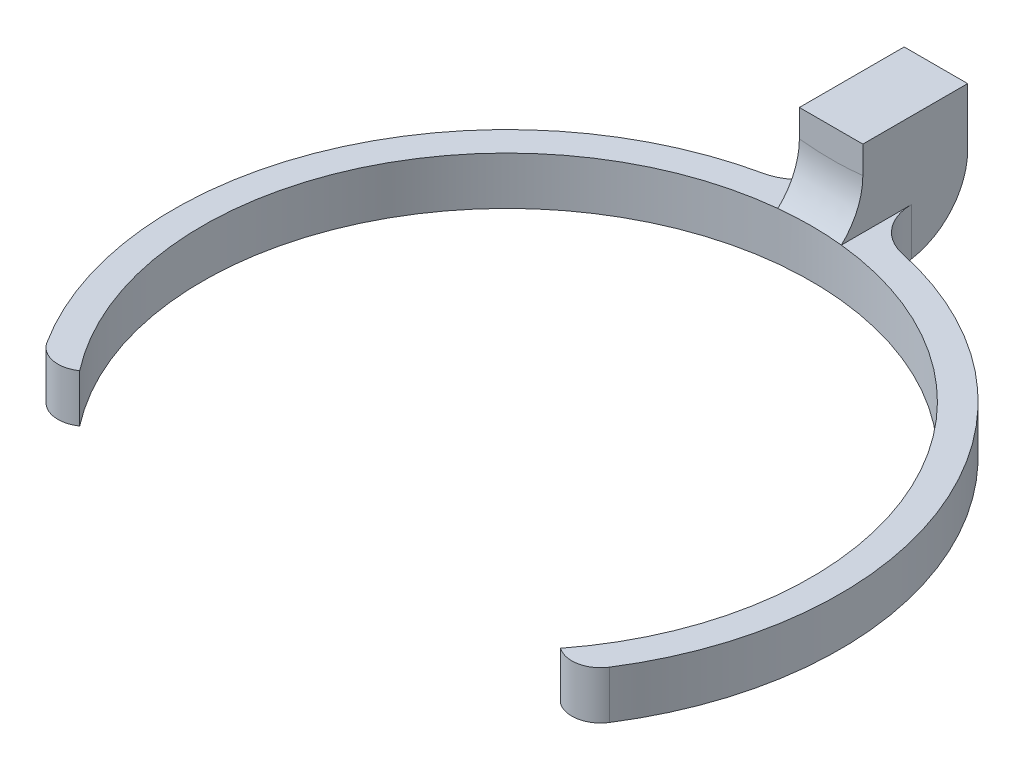
ISO-10303-21;
HEADER;
FILE_DESCRIPTION(('STEP AP214'),'2;1');
FILE_NAME('part.step','',(''),(''),'','','');
FILE_SCHEMA(('AUTOMOTIVE_DESIGN { 1 0 10303 214 1 1 1 1 }'));
ENDSEC;
DATA;
#1=APPLICATION_CONTEXT('core data for automotive mechanical design processes');
#2=APPLICATION_PROTOCOL_DEFINITION('international standard','automotive_design',2000,#1);
#3=PRODUCT_CONTEXT('',#1,'mechanical');
#4=PRODUCT('Part','Part','',(#3));
#5=PRODUCT_RELATED_PRODUCT_CATEGORY('part','',(#4));
#6=PRODUCT_DEFINITION_FORMATION('','',#4);
#7=PRODUCT_DEFINITION_CONTEXT('part definition',#1,'design');
#8=PRODUCT_DEFINITION('design','',#6,#7);
#9=PRODUCT_DEFINITION_SHAPE('','',#8);
#10=(LENGTH_UNIT() NAMED_UNIT(*) SI_UNIT(.MILLI.,.METRE.));
#11=(NAMED_UNIT(*) PLANE_ANGLE_UNIT() SI_UNIT($,.RADIAN.));
#12=(NAMED_UNIT(*) SI_UNIT($,.STERADIAN.) SOLID_ANGLE_UNIT());
#13=UNCERTAINTY_MEASURE_WITH_UNIT(LENGTH_MEASURE(1.E-05),#10,'distance_accuracy_value','');
#14=(GEOMETRIC_REPRESENTATION_CONTEXT(3) GLOBAL_UNCERTAINTY_ASSIGNED_CONTEXT((#13)) GLOBAL_UNIT_ASSIGNED_CONTEXT((#10,
#11,#12)) REPRESENTATION_CONTEXT('',''));
#15=CARTESIAN_POINT('',(0.,0.,0.));
#16=DIRECTION('',(0.,0.,1.));
#17=DIRECTION('',(1.,0.,0.));
#18=AXIS2_PLACEMENT_3D('',#15,#16,#17);
#19=CARTESIAN_POINT('',(25.0715260907681,5.,-19.4802741120328));
#20=DIRECTION('',(0.,-1.,0.));
#21=DIRECTION('',(0.,0.,-1.));
#22=AXIS2_PLACEMENT_3D('',#19,#20,#21);
#23=PLANE('',#22);
#24=DIRECTION('',(0.,0.,-1.));
#25=VECTOR('',#24,1.);
#26=CARTESIAN_POINT('',(28.3742706076514,5.,-64.2302741120327));
#27=LINE('',#26,#25);
#28=CARTESIAN_POINT('',(28.3742706076514,5.,-51.0580254356498));
#29=VERTEX_POINT('',#28);
#30=CARTESIAN_POINT('',(28.3742706076514,5.,-58.3534902574376));
#31=VERTEX_POINT('',#30);
#32=EDGE_CURVE('E53',#29,#31,#27,.T.);
#33=ORIENTED_EDGE('',*,*,#32,.F.);
#34=CARTESIAN_POINT('',(25.0715260907681,5.,-19.4802741120328));
#35=DIRECTION('',(0.,-1.,0.));
#36=DIRECTION('',(0.,0.,-1.));
#37=AXIS2_PLACEMENT_3D('',#34,#35,#36);
#38=CIRCLE('',#37,31.75);
#39=CARTESIAN_POINT('',(50.1430521815362,5.,0.));
#40=VERTEX_POINT('',#39);
#41=EDGE_CURVE('E361',#29,#40,#38,.T.);
#42=ORIENTED_EDGE('',*,*,#41,.T.);
#43=CARTESIAN_POINT('',(51.8697331633186,5.,-2.45327796777104));
#44=DIRECTION('',(0.,-1.,0.));
#45=DIRECTION('',(0.,0.,-1.));
#46=AXIS2_PLACEMENT_3D('',#43,#44,#45);
#47=CIRCLE('',#46,3.);
#48=CARTESIAN_POINT('',(54.4018472174179,5.,-0.84442793839198));
#49=VERTEX_POINT('',#48);
#50=EDGE_CURVE('E333',#40,#49,#47,.F.);
#51=ORIENTED_EDGE('',*,*,#50,.T.);
#52=CARTESIAN_POINT('',(25.0715260907681,5.,-19.4802741120328));
#53=DIRECTION('',(0.,1.,0.));
#54=DIRECTION('',(0.,0.,1.));
#55=AXIS2_PLACEMENT_3D('',#52,#53,#54);
#56=CIRCLE('',#55,34.75);
#57=CARTESIAN_POINT('',(32.3299002281692,5.,-53.4637775347452));
#58=VERTEX_POINT('',#57);
#59=EDGE_CURVE('E358',#49,#58,#56,.T.);
#60=ORIENTED_EDGE('',*,*,#59,.T.);
#61=CARTESIAN_POINT('',(33.3742706076514,5.,-58.3534902574376));
#62=DIRECTION('',(0.,-1.,0.));
#63=DIRECTION('',(0.,0.,-1.));
#64=AXIS2_PLACEMENT_3D('',#61,#62,#63);
#65=CIRCLE('',#64,5.);
#66=EDGE_CURVE('E181',#58,#31,#65,.T.);
#67=ORIENTED_EDGE('',*,*,#66,.T.);
#68=EDGE_LOOP('',(#33,#42,#51,#60,#67));
#69=FACE_BOUND('',#68,.T.);
#70=ADVANCED_FACE('F33',(#69),#23,.F.);
#71=CARTESIAN_POINT('',(0.,5.,0.));
#72=VERTEX_POINT('',#71);
#73=CARTESIAN_POINT('',(21.7543624608382,5.,-51.0565139998387));
#74=VERTEX_POINT('',#73);
#75=EDGE_CURVE('E172',#72,#74,#38,.T.);
#76=ORIENTED_EDGE('',*,*,#75,.T.);
#77=DIRECTION('',(0.,0.,1.));
#78=VECTOR('',#77,1.);
#79=CARTESIAN_POINT('',(21.7543624608382,5.,-64.2302741120327));
#80=LINE('',#79,#78);
#81=CARTESIAN_POINT('',(21.7543624608382,5.,-58.3504077515377));
#82=VERTEX_POINT('',#81);
#83=EDGE_CURVE('E60',#82,#74,#80,.T.);
#84=ORIENTED_EDGE('',*,*,#83,.F.);
#85=CARTESIAN_POINT('',(16.7543624608382,5.,-58.3504077515377));
#86=DIRECTION('',(0.,-1.,0.));
#87=DIRECTION('',(0.,0.,-1.));
#88=AXIS2_PLACEMENT_3D('',#85,#86,#87);
#89=CIRCLE('',#88,5.);
#90=CARTESIAN_POINT('',(17.8005465652319,5.,-53.4610827654364));
#91=VERTEX_POINT('',#90);
#92=EDGE_CURVE('E184',#82,#91,#89,.T.);
#93=ORIENTED_EDGE('',*,*,#92,.T.);
#94=CARTESIAN_POINT('',(25.0715260907681,5.,-19.4802741120328));
#95=DIRECTION('',(0.,1.,0.));
#96=DIRECTION('',(0.,0.,1.));
#97=AXIS2_PLACEMENT_3D('',#94,#95,#96);
#98=CIRCLE('',#97,34.75);
#99=CARTESIAN_POINT('',(-4.25879503588169,5.,-0.844427938391994));
#100=VERTEX_POINT('',#99);
#101=EDGE_CURVE('E347',#91,#100,#98,.T.);
#102=ORIENTED_EDGE('',*,*,#101,.T.);
#103=CARTESIAN_POINT('',(-1.72668098178243,5.,-2.45327796777105));
#104=DIRECTION('',(0.,-1.,0.));
#105=DIRECTION('',(0.,0.,-1.));
#106=AXIS2_PLACEMENT_3D('',#103,#104,#105);
#107=CIRCLE('',#106,3.);
#108=EDGE_CURVE('E331',#100,#72,#107,.F.);
#109=ORIENTED_EDGE('',*,*,#108,.T.);
#110=EDGE_LOOP('',(#76,#84,#93,#102,#109));
#111=FACE_BOUND('',#110,.T.);
#112=ADVANCED_FACE('F279',(#111),#23,.F.);
#113=CARTESIAN_POINT('',(25.0715260907681,5.,-19.4802741120328));
#114=DIRECTION('',(0.,-1.,0.));
#115=DIRECTION('',(0.,0.,-1.));
#116=AXIS2_PLACEMENT_3D('',#113,#114,#115);
#117=CYLINDRICAL_SURFACE('',#116,31.75);
#118=CARTESIAN_POINT('',(25.0715260907681,0.,-19.4802741120328));
#119=DIRECTION('',(0.,-1.,0.));
#120=DIRECTION('',(0.,0.,-1.));
#121=AXIS2_PLACEMENT_3D('',#118,#119,#120);
#122=CIRCLE('',#121,31.75);
#123=CARTESIAN_POINT('',(0.,0.,0.));
#124=VERTEX_POINT('',#123);
#125=CARTESIAN_POINT('',(50.1430521815362,0.,0.));
#126=VERTEX_POINT('',#125);
#127=EDGE_CURVE('E162',#124,#126,#122,.T.);
#128=ORIENTED_EDGE('',*,*,#127,.T.);
#129=DIRECTION('',(0.,-1.,0.));
#130=VECTOR('',#129,1.);
#131=CARTESIAN_POINT('',(50.1430521815362,5.,0.));
#132=LINE('',#131,#130);
#133=EDGE_CURVE('E344',#40,#126,#132,.T.);
#134=ORIENTED_EDGE('',*,*,#133,.F.);
#135=ORIENTED_EDGE('',*,*,#41,.F.);
#136=EDGE_CURVE('E362',#74,#29,#38,.T.);
#137=ORIENTED_EDGE('',*,*,#136,.F.);
#138=ORIENTED_EDGE('',*,*,#75,.F.);
#139=DIRECTION('',(0.,-1.,0.));
#140=VECTOR('',#139,1.);
#141=CARTESIAN_POINT('',(0.,5.,0.));
#142=LINE('',#141,#140);
#143=EDGE_CURVE('E342',#72,#124,#142,.T.);
#144=ORIENTED_EDGE('',*,*,#143,.T.);
#145=EDGE_LOOP('',(#128,#134,#135,#137,#138,#144));
#146=FACE_BOUND('',#145,.T.);
#147=ADVANCED_FACE('F217',(#146),#117,.F.);
#148=CARTESIAN_POINT('',(25.0715260907681,5.,-19.4802741120328));
#149=DIRECTION('',(0.,-1.,0.));
#150=DIRECTION('',(0.,0.,-1.));
#151=AXIS2_PLACEMENT_3D('',#148,#149,#150);
#152=CYLINDRICAL_SURFACE('',#151,34.75);
#153=ORIENTED_EDGE('',*,*,#59,.F.);
#154=DIRECTION('',(0.,-1.,0.));
#155=VECTOR('',#154,1.);
#156=CARTESIAN_POINT('',(54.4018472174179,5.,-0.844427938391977));
#157=LINE('',#156,#155);
#158=CARTESIAN_POINT('',(54.4018472174179,0.,-0.84442793839198));
#159=VERTEX_POINT('',#158);
#160=EDGE_CURVE('E180',#49,#159,#157,.T.);
#161=ORIENTED_EDGE('',*,*,#160,.T.);
#162=CARTESIAN_POINT('',(25.0715260907681,0.,-19.4802741120328));
#163=DIRECTION('',(0.,1.,0.));
#164=DIRECTION('',(0.,0.,1.));
#165=AXIS2_PLACEMENT_3D('',#162,#163,#164);
#166=CIRCLE('',#165,34.75);
#167=CARTESIAN_POINT('',(32.3299002281692,0.,-53.4637775347452));
#168=VERTEX_POINT('',#167);
#169=EDGE_CURVE('E165',#159,#168,#166,.T.);
#170=ORIENTED_EDGE('',*,*,#169,.T.);
#171=DIRECTION('',(0.,-1.,0.));
#172=VECTOR('',#171,1.);
#173=CARTESIAN_POINT('',(32.3299002281692,5.,-53.4637775347452));
#174=LINE('',#173,#172);
#175=EDGE_CURVE('E303',#168,#58,#174,.F.);
#176=ORIENTED_EDGE('',*,*,#175,.T.);
#177=EDGE_LOOP('',(#153,#161,#170,#176));
#178=FACE_BOUND('',#177,.T.);
#179=ADVANCED_FACE('F272',(#178),#152,.T.);
#180=CARTESIAN_POINT('',(28.3742706076514,5.,-64.2302741120327));
#181=DIRECTION('',(-1.,0.,0.));
#182=DIRECTION('',(0.,0.,1.));
#183=AXIS2_PLACEMENT_3D('',#180,#181,#182);
#184=PLANE('',#183);
#185=DIRECTION('',(0.,1.,0.));
#186=VECTOR('',#185,1.);
#187=CARTESIAN_POINT('',(28.3742706076514,0.,-58.3534902574376));
#188=LINE('',#187,#186);
#189=CARTESIAN_POINT('',(28.3742706076514,0.0907029669653227,-58.3534902574376));
#190=VERTEX_POINT('',#189);
#191=EDGE_CURVE('E190',#31,#190,#188,.F.);
#192=ORIENTED_EDGE('',*,*,#191,.T.);
#193=CARTESIAN_POINT('',(28.3742706076514,7.,-57.2302741120327));
#194=DIRECTION('',(-1.,0.,0.));
#195=DIRECTION('',(0.,0.,1.));
#196=AXIS2_PLACEMENT_3D('',#193,#194,#195);
#197=CIRCLE('',#196,7.);
#198=CARTESIAN_POINT('',(28.3742706076514,7.,-64.2302741120327));
#199=VERTEX_POINT('',#198);
#200=EDGE_CURVE('E230',#190,#199,#197,.F.);
#201=ORIENTED_EDGE('',*,*,#200,.T.);
#202=DIRECTION('',(0.,-1.,0.));
#203=VECTOR('',#202,1.);
#204=CARTESIAN_POINT('',(28.3742706076514,5.,-64.2302741120327));
#205=LINE('',#204,#203);
#206=CARTESIAN_POINT('',(28.3742706076514,13.,-64.2302741120327));
#207=VERTEX_POINT('',#206);
#208=EDGE_CURVE('E340',#207,#199,#205,.T.);
#209=ORIENTED_EDGE('',*,*,#208,.F.);
#210=DIRECTION('',(0.,0.,-1.));
#211=VECTOR('',#210,1.);
#212=CARTESIAN_POINT('',(28.3742706076514,13.,-64.2302741120327));
#213=LINE('',#212,#211);
#214=CARTESIAN_POINT('',(28.3742706076514,13.,-53.2997773588279));
#215=VERTEX_POINT('',#214);
#216=EDGE_CURVE('E150',#215,#207,#213,.T.);
#217=ORIENTED_EDGE('',*,*,#216,.F.);
#218=DIRECTION('',(0.,-1.,0.));
#219=VECTOR('',#218,1.);
#220=CARTESIAN_POINT('',(28.3742706076514,13.,-53.2997773588279));
#221=LINE('',#220,#219);
#222=CARTESIAN_POINT('',(28.3742706076514,10.162069291933,-53.2997773588279));
#223=VERTEX_POINT('',#222);
#224=EDGE_CURVE('E146',#215,#223,#221,.T.);
#225=ORIENTED_EDGE('',*,*,#224,.T.);
#226=CARTESIAN_POINT('',(13.9609573303086,11.4498546363416,-53.2997773588279));
#227=CARTESIAN_POINT('',(13.1948898658155,6.70385766261652,-53.2997773588279));
#228=CARTESIAN_POINT('',(12.9198644229667,5.,-48.8128433604175));
#229=CARTESIAN_POINT('',(14.4251321623132,11.3749814306244,-53.2997773588279));
#230=CARTESIAN_POINT('',(13.6465407558344,6.77310453828877,-53.2997773588279));
#231=CARTESIAN_POINT('',(13.3530938773272,5.,-48.9923362587884));
#232=CARTESIAN_POINT('',(14.8885052512929,11.2955040156614,-53.2997773588279));
#233=CARTESIAN_POINT('',(14.1107305119621,6.83035045345544,-53.2997773588279));
#234=CARTESIAN_POINT('',(13.7976541841074,5.,-49.1652412651511));
#235=CARTESIAN_POINT('',(15.8144138453253,11.131809056168,-53.2997773588279));
#236=CARTESIAN_POINT('',(15.0514507227598,6.92355512746249,-53.2997773588279));
#237=CARTESIAN_POINT('',(14.7085825697168,5.,-49.4953757876469));
#238=CARTESIAN_POINT('',(16.2769493632732,11.0475915852672,-53.2997773588279));
#239=CARTESIAN_POINT('',(15.5286925805461,6.95994932915546,-53.2997773588279));
#240=CARTESIAN_POINT('',(15.174950309781,5.,-49.6526055471665));
#241=CARTESIAN_POINT('',(17.2048917657922,10.8783480502197,-53.2997773588279));
#242=CARTESIAN_POINT('',(16.4963550390549,7.01605886874081,-53.2997773588279));
#243=CARTESIAN_POINT('',(16.1316726494976,5.,-49.9498336816412));
#244=CARTESIAN_POINT('',(17.6702982862959,10.7933202427429,-53.2997773588279));
#245=CARTESIAN_POINT('',(16.9877198695653,7.0359647201614,-53.2997773588279));
#246=CARTESIAN_POINT('',(16.6221604386719,5.,-50.0897166398709));
#247=CARTESIAN_POINT('',(18.6019711156805,10.6279662304333,-53.2997773588279));
#248=CARTESIAN_POINT('',(17.9792058197056,7.0633873353023,-53.2997773588279));
#249=CARTESIAN_POINT('',(17.623058697565,5.,-50.3485422154673));
#250=CARTESIAN_POINT('',(19.0682374343301,10.5476400793625,-53.2997773588279));
#251=CARTESIAN_POINT('',(18.4802675320743,7.07107799973619,-53.2997773588279));
#252=CARTESIAN_POINT('',(18.1334693949852,5.,-50.4674845934157));
#253=CARTESIAN_POINT('',(19.9932171154241,10.3984861517778,-53.2997773588279));
#254=CARTESIAN_POINT('',(19.480006593991,7.07851044141761,-53.2997773588279));
#255=CARTESIAN_POINT('',(19.1620573500771,5.,-50.6798082129751));
#256=CARTESIAN_POINT('',(20.4518982311685,10.3294629643456,-53.2997773588279));
#257=CARTESIAN_POINT('',(19.9794316330727,7.07848376402573,-53.2997773588279));
#258=CARTESIAN_POINT('',(19.6798832980016,5.,-50.773647015747));
#259=CARTESIAN_POINT('',(21.3712246242751,10.2061616708167,-53.2997773588279));
#260=CARTESIAN_POINT('',(20.9840916723767,7.07486427832106,-53.2997773588279));
#261=CARTESIAN_POINT('',(20.7300922025885,5.,-50.9365403973593));
#262=CARTESIAN_POINT('',(21.8318696095352,10.1518814446053,-53.2997773588279));
#263=CARTESIAN_POINT('',(21.4903902637497,7.07129296829578,-53.2997773588279));
#264=CARTESIAN_POINT('',(21.2624730540474,5.,-51.0055985402468));
#265=CARTESIAN_POINT('',(22.753721263875,10.0628712097939,-53.2997773588279));
#266=CARTESIAN_POINT('',(22.5055789206932,7.06401277764101,-53.2997773588279));
#267=CARTESIAN_POINT('',(22.3364651911851,5.,-51.1168414873075));
#268=CARTESIAN_POINT('',(23.2149221868779,10.0280835309399,-53.2997773588279));
#269=CARTESIAN_POINT('',(23.0155875316113,7.06029678626149,-53.2997773588279));
#270=CARTESIAN_POINT('',(22.8780443116594,5.,-51.1591056130005));
#271=CARTESIAN_POINT('',(24.1384496818586,9.98117651486249,-53.2997773588279));
#272=CARTESIAN_POINT('',(24.037199553134,7.05504959287818,-53.2997773588279));
#273=CARTESIAN_POINT('',(23.9669302378092,5.,-51.2157366143112));
#274=CARTESIAN_POINT('',(24.6007761062926,9.96905435137164,-53.2997773588279));
#275=CARTESIAN_POINT('',(24.5499981795356,7.0535067655845,-53.2997773588279));
#276=CARTESIAN_POINT('',(24.5142363208037,5.,-51.2301069681402));
#277=CARTESIAN_POINT('',(25.6138916301734,9.96877071077388,-53.2997773588279));
#278=CARTESIAN_POINT('',(25.6723853111803,7.05348982914659,-53.2997773588279));
#279=CARTESIAN_POINT('',(25.7135970404278,5.,-51.2304698065619));
#280=CARTESIAN_POINT('',(26.1646883950659,9.98563526696418,-53.2997773588279));
#281=CARTESIAN_POINT('',(26.2836253924319,7.05565951250661,-53.2997773588279));
#282=CARTESIAN_POINT('',(26.3656656594411,5.,-51.210509210123));
#283=CARTESIAN_POINT('',(27.2651687598048,10.051040647214,-53.2997773588279));
#284=CARTESIAN_POINT('',(27.5002749852684,7.06270656468473,-53.2997773588279));
#285=CARTESIAN_POINT('',(27.6611530847468,5.,-51.1311589116622));
#286=CARTESIAN_POINT('',(27.8148492266015,10.0996314692522,-53.2997773588279));
#287=CARTESIAN_POINT('',(28.1076875790396,7.06760910377077,-53.2997773588279));
#288=CARTESIAN_POINT('',(28.304556599364,5.,-51.0717069719698));
#289=CARTESIAN_POINT('',(28.9170518861419,10.2226459442944,-53.2997773588279));
#290=CARTESIAN_POINT('',(29.3185335518002,7.07561346234696,-53.2997773588279));
#291=CARTESIAN_POINT('',(29.5804483313175,5.,-50.9151232031936));
#292=CARTESIAN_POINT('',(29.469543185331,10.2973358535277,-53.2997773588279));
#293=CARTESIAN_POINT('',(29.9237465124306,7.07869605133089,-53.2997773588279));
#294=CARTESIAN_POINT('',(30.2127506397295,5.,-50.8176017485778));
#295=CARTESIAN_POINT('',(30.2955730973994,10.4220740330581,-53.2997773588279));
#296=CARTESIAN_POINT('',(30.8188601248027,7.07715716379731,-53.2997773588279));
#297=CARTESIAN_POINT('',(31.1427400321195,5.,-50.6459936528312));
#298=CARTESIAN_POINT('',(30.570123995297,10.4657082522839,-53.2997773588279));
#299=CARTESIAN_POINT('',(31.11620248234,7.07560541468494,-53.2997773588279));
#300=CARTESIAN_POINT('',(31.4492877451345,5.,-50.5846623093497));
#301=CARTESIAN_POINT('',(31.1186629939983,10.5561175695072,-53.2997773588279));
#302=CARTESIAN_POINT('',(31.7076499596367,7.06958686901267,-53.2997773588279));
#303=CARTESIAN_POINT('',(32.056021108757,5.,-50.4540632125707));
#304=CARTESIAN_POINT('',(31.3926511815037,10.602892139272,-53.2997773588279));
#305=CARTESIAN_POINT('',(32.0019630747874,7.06510119484682,-53.2997773588279));
#306=CARTESIAN_POINT('',(32.356207818217,5.,-50.3847967926403));
#307=CARTESIAN_POINT('',(31.6664578386366,10.6506910525698,-53.2997773588279));
#308=CARTESIAN_POINT('',(32.2935833191369,7.05872520916416,-53.2997773588279));
#309=CARTESIAN_POINT('',(32.6530185399325,5.,-50.3118078436404));
#310=(BOUNDED_SURFACE() B_SPLINE_SURFACE(3,2,((#226,#227,#228),(#229,#230,#231),(#232,#233,
#234),(#235,#236,#237),(#238,#239,#240),(#241,#242,#243),(#244,#245,#246),(#247,#248,#249),
(#250,#251,#252),(#253,#254,#255),(#256,#257,#258),(#259,#260,#261),(#262,#263,#264),(#265,#266,
#267),(#268,#269,#270),(#271,#272,#273),(#274,#275,#276),(#277,#278,#279),(#280,#281,#282),
(#283,#284,#285),(#286,#287,#288),(#289,#290,#291),(#292,#293,#294),(#295,#296,#297),(#298,#299,
#300),(#301,#302,#303),(#304,#305,#306),(#307,#308,#309)),.UNSPECIFIED.,.F.,.F.,
.F.) B_SPLINE_SURFACE_WITH_KNOTS((4,2,2,2,2,2,2,2,2,2,2,2,2,4),(3,3),(0.,1.41042414116646,
2.82082637953823,4.24015954851565,5.65950894398561,7.0508857926099,8.44206244792104,
9.82910116517766,11.2159669146514,12.8680787384167,14.5228004587668,16.1949213423707,
17.0289010800332,17.8627408852554),(0.,1.),
.UNSPECIFIED.) GEOMETRIC_REPRESENTATION_ITEM() RATIONAL_B_SPLINE_SURFACE(((1.,0.82432075941302,
1.),(1.,0.832096871131908,1.),(1.,0.839478555641959,1.),(1.,0.85340834181888,1.),(1.,
0.859956456428865,1.),(1.,0.872213302509118,1.),(1.,0.877916456291373,1.),(1.,0.888383313480635,
1.),(1.,0.893147006146653,1.),(1.,0.901596832977153,1.),(1.,0.905302353426893,1.),(1.,
0.911705889929848,1.),(1.,0.914404050867542,1.),(1.,0.918738656890733,1.),(1.,0.920378236089776,
1.),(1.,0.92257310424114,1.),(1.,0.923128528382128,1.),(1.,0.923142709255391,1.),(1.,
0.92237140528869,1.),(1.,0.919293733793828,1.),(1.,0.91698494319899,1.),(1.,0.910866076966779,
1.),(1.,0.907040470796006,1.),(1.,0.900249441612083,1.),(1.,0.897814024511458,1.),(1.,
0.892603756115899,1.),(1.,0.889828961842777,1.),(1.,0.886889850014105,1.))) REPRESENTATION_ITEM('') SURFACE());
#311=CARTESIAN_POINT('',(28.3742706076514,10.162069291933,-53.2997773588279));
#312=CARTESIAN_POINT('',(28.3742706076514,9.9633046200011,-53.2997978409106));
#313=CARTESIAN_POINT('',(28.3742706076514,9.76454167637027,-53.2914169872598));
#314=CARTESIAN_POINT('',(28.3742706076514,9.36842064209965,-53.2579897216726));
#315=CARTESIAN_POINT('',(28.3742706076514,9.17106256012742,-53.2329432070043));
#316=CARTESIAN_POINT('',(28.3742706076514,8.77904950576775,-53.1663037802152));
#317=CARTESIAN_POINT('',(28.3742706076514,8.58439604777989,-53.1247019563706));
#318=CARTESIAN_POINT('',(28.3742706076514,8.19929760623533,-53.0252422073789));
#319=CARTESIAN_POINT('',(28.3742706076514,8.008852410605,-52.9673851034344));
#320=CARTESIAN_POINT('',(28.3742706076514,7.63336776625726,-52.8357436383506));
#321=CARTESIAN_POINT('',(28.3742706076514,7.44833300640905,-52.761945901366));
#322=CARTESIAN_POINT('',(28.3742706076514,7.08516702311782,-52.5989674678153));
#323=CARTESIAN_POINT('',(28.3742706076514,6.9070357542556,-52.5097868724765));
#324=CARTESIAN_POINT('',(28.3742706076514,6.55924243749107,-52.3168100714338));
#325=CARTESIAN_POINT('',(28.3742706076514,6.3895675306238,-52.2130370346277));
#326=CARTESIAN_POINT('',(28.3742706076514,6.05966979324576,-51.9915468752919));
#327=CARTESIAN_POINT('',(28.3742706076514,5.89944302477087,-51.8738356246035));
#328=CARTESIAN_POINT('',(28.3742706076514,5.61220204036991,-51.6434144015421));
#329=CARTESIAN_POINT('',(28.3742706076514,5.48375483699127,-51.5324847845627));
#330=CARTESIAN_POINT('',(28.3742706076514,5.23538166485451,-51.3017700705781));
#331=CARTESIAN_POINT('',(28.3742706076514,5.11544504224066,-51.1819964425081));
#332=CARTESIAN_POINT('',(28.3742706076514,4.99999999999999,-51.0580254356498));
#333=B_SPLINE_CURVE_WITH_KNOTS('',3,(#311,#312,#313,#314,#315,#316,#317,#318,#319,#320,#321,
#322,#323,#324,#325,#326,#327,#328,#329,#330,#331,#332),.UNSPECIFIED.,.F.,.F.,(4,2,2,2,2,2,2,2,
2,2,4),(0.,0.596115089360105,1.19223385338176,1.7886739431763,2.38508390675355,2.9819962778461,
3.57890472108875,4.17487591515678,4.7705969279039,5.27931409932402,5.78738277502364),.UNSPECIFIED.);
#334=EDGE_CURVE('E45',#223,#29,#333,.T.);
#335=ORIENTED_EDGE('',*,*,#334,.T.);
#336=ORIENTED_EDGE('',*,*,#32,.T.);
#337=EDGE_LOOP('',(#192,#201,#209,#217,#225,#335,#336));
#338=FACE_BOUND('',#337,.T.);
#339=ADVANCED_FACE('F268',(#338),#184,.F.);
#340=CARTESIAN_POINT('',(21.7543624608382,5.,-64.2302741120327));
#341=DIRECTION('',(0.,0.,1.));
#342=DIRECTION('',(1.,0.,0.));
#343=AXIS2_PLACEMENT_3D('',#340,#341,#342);
#344=PLANE('',#343);
#345=ORIENTED_EDGE('',*,*,#208,.T.);
#346=DIRECTION('',(-1.,0.,0.));
#347=VECTOR('',#346,1.);
#348=CARTESIAN_POINT('',(21.7543624608382,7.,-64.2302741120327));
#349=LINE('',#348,#347);
#350=CARTESIAN_POINT('',(21.7543624608382,7.,-64.2302741120327));
#351=VERTEX_POINT('',#350);
#352=EDGE_CURVE('E192',#199,#351,#349,.T.);
#353=ORIENTED_EDGE('',*,*,#352,.T.);
#354=DIRECTION('',(0.,-1.,0.));
#355=VECTOR('',#354,1.);
#356=CARTESIAN_POINT('',(21.7543624608382,5.,-64.2302741120327));
#357=LINE('',#356,#355);
#358=CARTESIAN_POINT('',(21.7543624608382,13.,-64.2302741120327));
#359=VERTEX_POINT('',#358);
#360=EDGE_CURVE('E339',#359,#351,#357,.T.);
#361=ORIENTED_EDGE('',*,*,#360,.F.);
#362=DIRECTION('',(-1.,0.,0.));
#363=VECTOR('',#362,1.);
#364=CARTESIAN_POINT('',(21.7543624608382,13.,-64.2302741120327));
#365=LINE('',#364,#363);
#366=EDGE_CURVE('E157',#207,#359,#365,.T.);
#367=ORIENTED_EDGE('',*,*,#366,.F.);
#368=EDGE_LOOP('',(#345,#353,#361,#367));
#369=FACE_BOUND('',#368,.T.);
#370=ADVANCED_FACE('F265',(#369),#344,.F.);
#371=CARTESIAN_POINT('',(21.7543624608382,5.,-64.2302741120327));
#372=DIRECTION('',(1.,0.,0.));
#373=DIRECTION('',(0.,0.,-1.));
#374=AXIS2_PLACEMENT_3D('',#371,#372,#373);
#375=PLANE('',#374);
#376=ORIENTED_EDGE('',*,*,#360,.T.);
#377=CARTESIAN_POINT('',(21.7543624608382,7.,-57.2302741120327));
#378=DIRECTION('',(1.,0.,0.));
#379=DIRECTION('',(0.,0.,-1.));
#380=AXIS2_PLACEMENT_3D('',#377,#378,#379);
#381=CIRCLE('',#380,7.);
#382=CARTESIAN_POINT('',(21.7543624608382,0.0902025623286612,-58.3504077515377));
#383=VERTEX_POINT('',#382);
#384=EDGE_CURVE('E194',#351,#383,#381,.F.);
#385=ORIENTED_EDGE('',*,*,#384,.T.);
#386=DIRECTION('',(0.,1.,0.));
#387=VECTOR('',#386,1.);
#388=CARTESIAN_POINT('',(21.7543624608382,5.,-58.3504077515377));
#389=LINE('',#388,#387);
#390=EDGE_CURVE('E187',#383,#82,#389,.T.);
#391=ORIENTED_EDGE('',*,*,#390,.T.);
#392=ORIENTED_EDGE('',*,*,#83,.T.);
#393=CARTESIAN_POINT('',(21.7543624608382,5.,-51.0565139998387));
#394=CARTESIAN_POINT('',(21.7543624608382,5.13464315222825,-51.2012206632253));
#395=CARTESIAN_POINT('',(21.7543624608382,5.27543440486397,-51.3401985967438));
#396=CARTESIAN_POINT('',(21.7543624608382,5.56822578652942,-51.6057855664916));
#397=CARTESIAN_POINT('',(21.7543624608382,5.72022541857957,-51.7323951505557));
#398=CARTESIAN_POINT('',(21.7543624608382,6.03436420910706,-51.9723514376556));
#399=CARTESIAN_POINT('',(21.7543624608382,6.19650374501578,-52.0856976465456));
#400=CARTESIAN_POINT('',(21.7543624608382,6.5297417574576,-52.2983352989134));
#401=CARTESIAN_POINT('',(21.7543624608382,6.70083991178788,-52.3976272473872));
#402=CARTESIAN_POINT('',(21.7543624608382,7.05087892788276,-52.5815282682774));
#403=CARTESIAN_POINT('',(21.7543624608382,7.22982427599526,-52.6661288006414));
#404=CARTESIAN_POINT('',(21.7543624608382,7.59418967317207,-52.8199981126217));
#405=CARTESIAN_POINT('',(21.7543624608382,7.77960973391048,-52.8892668645926));
#406=CARTESIAN_POINT('',(21.7543624608382,8.1553559715113,-53.0119207640409));
#407=CARTESIAN_POINT('',(21.7543624608382,8.34567530663632,-53.0653268810718));
#408=CARTESIAN_POINT('',(21.7543624608382,8.73004570525723,-53.1560069962511));
#409=CARTESIAN_POINT('',(21.7543624608382,8.9240952762436,-53.1932873117529));
#410=CARTESIAN_POINT('',(21.7543624608382,9.29226296732523,-53.2481641442486));
#411=CARTESIAN_POINT('',(21.7543624608382,9.46612048494137,-53.2675251171817));
#412=CARTESIAN_POINT('',(21.7543624608382,9.81454540964607,-53.2933279608618));
#413=CARTESIAN_POINT('',(21.7543624608382,9.98911147365735,-53.2997879713793));
#414=CARTESIAN_POINT('',(21.7543624608382,10.1636863386272,-53.2997773588279));
#415=B_SPLINE_CURVE_WITH_KNOTS('',3,(#393,#394,#395,#396,#397,#398,#399,#400,#401,#402,#403,
#404,#405,#406,#407,#408,#409,#410,#411,#412,#413,#414),.UNSPECIFIED.,.F.,.F.,(4,2,2,2,2,2,2,2,
2,2,4),(0.,0.592789852883247,1.18555343724846,1.77833909883336,2.37110345510299,
2.96421123745401,3.55732008925127,4.14964135716705,4.7417303700121,5.26605624550044,
5.78964435691538),.UNSPECIFIED.);
#416=CARTESIAN_POINT('',(21.7543624608382,10.1636863386272,-53.2997773588279));
#417=VERTEX_POINT('',#416);
#418=EDGE_CURVE('E11',#74,#417,#415,.T.);
#419=ORIENTED_EDGE('',*,*,#418,.T.);
#420=DIRECTION('',(0.,-1.,0.));
#421=VECTOR('',#420,1.);
#422=CARTESIAN_POINT('',(21.7543624608382,13.,-53.2997773588279));
#423=LINE('',#422,#421);
#424=CARTESIAN_POINT('',(21.7543624608382,13.,-53.2997773588279));
#425=VERTEX_POINT('',#424);
#426=EDGE_CURVE('E143',#425,#417,#423,.T.);
#427=ORIENTED_EDGE('',*,*,#426,.F.);
#428=DIRECTION('',(0.,0.,1.));
#429=VECTOR('',#428,1.);
#430=CARTESIAN_POINT('',(21.7543624608382,13.,-64.2302741120327));
#431=LINE('',#430,#429);
#432=EDGE_CURVE('E151',#359,#425,#431,.T.);
#433=ORIENTED_EDGE('',*,*,#432,.F.);
#434=EDGE_LOOP('',(#376,#385,#391,#392,#419,#427,#433));
#435=FACE_BOUND('',#434,.T.);
#436=ADVANCED_FACE('F160',(#435),#375,.F.);
#437=CARTESIAN_POINT('',(25.0715260907681,5.,-19.4802741120328));
#438=DIRECTION('',(0.,-1.,0.));
#439=DIRECTION('',(0.,0.,-1.));
#440=AXIS2_PLACEMENT_3D('',#437,#438,#439);
#441=CYLINDRICAL_SURFACE('',#440,34.75);
#442=CARTESIAN_POINT('',(25.0715260907681,0.,-19.4802741120328));
#443=DIRECTION('',(0.,1.,0.));
#444=DIRECTION('',(0.,0.,1.));
#445=AXIS2_PLACEMENT_3D('',#442,#443,#444);
#446=CIRCLE('',#445,34.75);
#447=CARTESIAN_POINT('',(17.8005465652319,0.,-53.4610827654364));
#448=VERTEX_POINT('',#447);
#449=CARTESIAN_POINT('',(-4.25879503588169,0.,-0.844427938391994));
#450=VERTEX_POINT('',#449);
#451=EDGE_CURVE('E300',#448,#450,#446,.T.);
#452=ORIENTED_EDGE('',*,*,#451,.T.);
#453=DIRECTION('',(0.,-1.,0.));
#454=VECTOR('',#453,1.);
#455=CARTESIAN_POINT('',(-4.2587950358817,5.,-0.844427938391991));
#456=LINE('',#455,#454);
#457=EDGE_CURVE('E334',#450,#100,#456,.F.);
#458=ORIENTED_EDGE('',*,*,#457,.T.);
#459=ORIENTED_EDGE('',*,*,#101,.F.);
#460=DIRECTION('',(0.,-1.,0.));
#461=VECTOR('',#460,1.);
#462=CARTESIAN_POINT('',(17.8005465652319,5.,-53.4610827654364));
#463=LINE('',#462,#461);
#464=EDGE_CURVE('E191',#91,#448,#463,.T.);
#465=ORIENTED_EDGE('',*,*,#464,.T.);
#466=EDGE_LOOP('',(#452,#458,#459,#465));
#467=FACE_BOUND('',#466,.T.);
#468=ADVANCED_FACE('F264',(#467),#441,.T.);
#469=CARTESIAN_POINT('',(25.0715260907681,0.,-19.4802741120328));
#470=DIRECTION('',(0.,-1.,0.));
#471=DIRECTION('',(0.,0.,-1.));
#472=AXIS2_PLACEMENT_3D('',#469,#470,#471);
#473=PLANE('',#472);
#474=CARTESIAN_POINT('',(16.7543624608382,0.,-58.3504077515377));
#475=DIRECTION('',(0.,-1.,0.));
#476=DIRECTION('',(0.,0.,-1.));
#477=AXIS2_PLACEMENT_3D('',#474,#475,#476);
#478=CIRCLE('',#477,5.);
#479=CARTESIAN_POINT('',(21.6272774641652,0.,-57.2302741120327));
#480=VERTEX_POINT('',#479);
#481=EDGE_CURVE('E296',#448,#480,#478,.F.);
#482=ORIENTED_EDGE('',*,*,#481,.T.);
#483=DIRECTION('',(-1.,0.,0.));
#484=VECTOR('',#483,1.);
#485=CARTESIAN_POINT('',(28.3742706076514,0.,-57.2302741120327));
#486=LINE('',#485,#484);
#487=CARTESIAN_POINT('',(28.5020652044791,0.,-57.2302741120327));
#488=VERTEX_POINT('',#487);
#489=EDGE_CURVE('E203',#480,#488,#486,.F.);
#490=ORIENTED_EDGE('',*,*,#489,.T.);
#491=CARTESIAN_POINT('',(33.3742706076514,0.,-58.3534902574376));
#492=DIRECTION('',(0.,-1.,0.));
#493=DIRECTION('',(0.,0.,-1.));
#494=AXIS2_PLACEMENT_3D('',#491,#492,#493);
#495=CIRCLE('',#494,5.);
#496=EDGE_CURVE('E314',#488,#168,#495,.F.);
#497=ORIENTED_EDGE('',*,*,#496,.T.);
#498=ORIENTED_EDGE('',*,*,#169,.F.);
#499=CARTESIAN_POINT('',(51.8697331633186,0.,-2.45327796777104));
#500=DIRECTION('',(0.,-1.,0.));
#501=DIRECTION('',(0.,0.,-1.));
#502=AXIS2_PLACEMENT_3D('',#499,#500,#501);
#503=CIRCLE('',#502,3.);
#504=EDGE_CURVE('E329',#159,#126,#503,.T.);
#505=ORIENTED_EDGE('',*,*,#504,.T.);
#506=ORIENTED_EDGE('',*,*,#127,.F.);
#507=CARTESIAN_POINT('',(-1.72668098178243,0.,-2.45327796777105));
#508=DIRECTION('',(0.,-1.,0.));
#509=DIRECTION('',(0.,0.,-1.));
#510=AXIS2_PLACEMENT_3D('',#507,#508,#509);
#511=CIRCLE('',#510,3.);
#512=EDGE_CURVE('E327',#124,#450,#511,.T.);
#513=ORIENTED_EDGE('',*,*,#512,.T.);
#514=ORIENTED_EDGE('',*,*,#451,.F.);
#515=EDGE_LOOP('',(#482,#490,#497,#498,#505,#506,#513,#514));
#516=FACE_BOUND('',#515,.T.);
#517=ADVANCED_FACE('F215',(#516),#473,.T.);
#518=CARTESIAN_POINT('',(16.7543624608382,5.,-58.3504077515377));
#519=DIRECTION('',(0.,-1.,0.));
#520=DIRECTION('',(0.,0.,-1.));
#521=AXIS2_PLACEMENT_3D('',#518,#519,#520);
#522=CYLINDRICAL_SURFACE('',#521,5.);
#523=ORIENTED_EDGE('',*,*,#390,.F.);
#524=CARTESIAN_POINT('',(21.7543624608382,0.0902025623286612,-58.3504077515377));
#525=CARTESIAN_POINT('',(21.7543712234041,0.075028301771851,-58.2568599305481));
#526=CARTESIAN_POINT('',(21.751737055117,0.0617717753289739,-58.1629987887806));
#527=CARTESIAN_POINT('',(21.7411688667015,0.0391536598942254,-57.9755621757793));
#528=CARTESIAN_POINT('',(21.7332602057732,0.0297737802490046,-57.881987479684));
#529=CARTESIAN_POINT('',(21.7121297520492,0.0148235430827614,-57.6951341329417));
#530=CARTESIAN_POINT('',(21.6989079595349,0.00925318535994023,-57.601855482279));
#531=CARTESIAN_POINT('',(21.6671143322344,0.00182795589208138,-57.4156035608664));
#532=CARTESIAN_POINT('',(21.6485171400632,-8.96630325913141E-06,-57.3226339008998));
#533=CARTESIAN_POINT('',(21.6272774641652,0.,-57.2302741120327));
#534=B_SPLINE_CURVE_WITH_KNOTS('',3,(#524,#525,#526,#527,#528,#529,#530,#531,#532,#533),
.UNSPECIFIED.,.F.,.F.,(4,2,2,2,4),(0.,0.284258381505515,0.567159837776149,0.850061279060875,
1.13431966215726),.UNSPECIFIED.);
#535=EDGE_CURVE('E196',#383,#480,#534,.T.);
#536=ORIENTED_EDGE('',*,*,#535,.T.);
#537=ORIENTED_EDGE('',*,*,#481,.F.);
#538=ORIENTED_EDGE('',*,*,#464,.F.);
#539=ORIENTED_EDGE('',*,*,#92,.F.);
#540=EDGE_LOOP('',(#523,#536,#537,#538,#539));
#541=FACE_BOUND('',#540,.T.);
#542=ADVANCED_FACE('F209',(#541),#522,.F.);
#543=CARTESIAN_POINT('',(33.3742706076514,5.,-58.3534902574376));
#544=DIRECTION('',(0.,-1.,0.));
#545=DIRECTION('',(0.,0.,-1.));
#546=AXIS2_PLACEMENT_3D('',#543,#544,#545);
#547=CYLINDRICAL_SURFACE('',#546,5.);
#548=ORIENTED_EDGE('',*,*,#496,.F.);
#549=CARTESIAN_POINT('',(28.5020652044791,0.,-57.2302741120327));
#550=CARTESIAN_POINT('',(28.4807066161226,-9.06626159954775E-06,-57.3228823812015));
#551=CARTESIAN_POINT('',(28.4620052279504,0.00183780512180809,-57.4161057088221));
#552=CARTESIAN_POINT('',(28.4300339489259,0.00930370615885683,-57.6028677008774));
#553=CARTESIAN_POINT('',(28.416738417029,0.0149045863688703,-57.6964027036602));
#554=CARTESIAN_POINT('',(28.395490253179,0.0299372917912853,-57.8837712589659));
#555=CARTESIAN_POINT('',(28.3875376215135,0.0393691172100144,-57.9776048115048));
#556=CARTESIAN_POINT('',(28.3769105462687,0.062113090136165,-58.1655615185148));
#557=CARTESIAN_POINT('',(28.3742617456271,0.0754437339232411,-58.2596838868992));
#558=CARTESIAN_POINT('',(28.3742706076514,0.0907029669653237,-58.3534902574376));
#559=B_SPLINE_CURVE_WITH_KNOTS('',3,(#549,#550,#551,#552,#553,#554,#555,#556,#557,#558),
.UNSPECIFIED.,.F.,.F.,(4,2,2,2,4),(0.,0.28506444055959,0.568760531787955,0.852456638295668,
1.13752107723365),.UNSPECIFIED.);
#560=EDGE_CURVE('E225',#488,#190,#559,.T.);
#561=ORIENTED_EDGE('',*,*,#560,.T.);
#562=ORIENTED_EDGE('',*,*,#191,.F.);
#563=ORIENTED_EDGE('',*,*,#66,.F.);
#564=ORIENTED_EDGE('',*,*,#175,.F.);
#565=EDGE_LOOP('',(#548,#561,#562,#563,#564));
#566=FACE_BOUND('',#565,.T.);
#567=ADVANCED_FACE('F214',(#566),#547,.F.);
#568=CARTESIAN_POINT('',(21.7543624608382,13.,-53.2997773588279));
#569=DIRECTION('',(0.,0.,-1.));
#570=DIRECTION('',(-1.,0.,0.));
#571=AXIS2_PLACEMENT_3D('',#568,#569,#570);
#572=PLANE('',#571);
#573=ORIENTED_EDGE('',*,*,#426,.T.);
#574=CARTESIAN_POINT('',(13.9609573303086,11.4498546363416,-53.2997773588279));
#575=CARTESIAN_POINT('',(14.4251321623132,11.3749814306244,-53.2997773588279));
#576=CARTESIAN_POINT('',(14.8885052512929,11.2955040156614,-53.2997773588279));
#577=CARTESIAN_POINT('',(15.8144138453253,11.131809056168,-53.2997773588279));
#578=CARTESIAN_POINT('',(16.2769493632732,11.0475915852672,-53.2997773588279));
#579=CARTESIAN_POINT('',(17.2048917657922,10.8783480502197,-53.2997773588279));
#580=CARTESIAN_POINT('',(17.6702982862959,10.7933202427429,-53.2997773588279));
#581=CARTESIAN_POINT('',(18.6019711156805,10.6279662304333,-53.2997773588279));
#582=CARTESIAN_POINT('',(19.0682374343301,10.5476400793625,-53.2997773588279));
#583=CARTESIAN_POINT('',(19.9932171154241,10.3984861517778,-53.2997773588279));
#584=CARTESIAN_POINT('',(20.4518982311685,10.3294629643456,-53.2997773588279));
#585=CARTESIAN_POINT('',(21.3712246242751,10.2061616708167,-53.2997773588279));
#586=CARTESIAN_POINT('',(21.8318696095352,10.1518814446053,-53.2997773588279));
#587=CARTESIAN_POINT('',(22.753721263875,10.0628712097939,-53.2997773588279));
#588=CARTESIAN_POINT('',(23.2149221868779,10.0280835309399,-53.2997773588279));
#589=CARTESIAN_POINT('',(24.1384496818586,9.98117651486249,-53.2997773588279));
#590=CARTESIAN_POINT('',(24.6007761062926,9.96905435137164,-53.2997773588279));
#591=CARTESIAN_POINT('',(25.6138916301734,9.96877071077388,-53.2997773588279));
#592=CARTESIAN_POINT('',(26.1646883950659,9.98563526696418,-53.2997773588279));
#593=CARTESIAN_POINT('',(27.2651687598048,10.051040647214,-53.2997773588279));
#594=CARTESIAN_POINT('',(27.8148492266015,10.0996314692522,-53.2997773588279));
#595=CARTESIAN_POINT('',(28.9170518861419,10.2226459442944,-53.2997773588279));
#596=CARTESIAN_POINT('',(29.469543185331,10.2973358535277,-53.2997773588279));
#597=CARTESIAN_POINT('',(30.2955730973994,10.4220740330581,-53.2997773588279));
#598=CARTESIAN_POINT('',(30.570123995297,10.4657082522839,-53.2997773588279));
#599=CARTESIAN_POINT('',(31.1186629939983,10.5561175695072,-53.2997773588279));
#600=CARTESIAN_POINT('',(31.3926511815037,10.602892139272,-53.2997773588279));
#601=CARTESIAN_POINT('',(31.6664578386366,10.6506910525698,-53.2997773588279));
#602=B_SPLINE_CURVE_WITH_KNOTS('',3,(#574,#575,#576,#577,#578,#579,#580,#581,#582,#583,#584,
#585,#586,#587,#588,#589,#590,#591,#592,#593,#594,#595,#596,#597,#598,#599,#600,#601),
.UNSPECIFIED.,.F.,.F.,(4,2,2,2,2,2,2,2,2,2,2,2,2,4),(0.,1.41042414116646,2.82082637953823,
4.24015954851565,5.65950894398561,7.0508857926099,8.44206244792104,9.82910116517766,
11.2159669146514,12.8680787384167,14.5228004587668,16.1949213423707,17.0289010800332,
17.8627408852554),.UNSPECIFIED.);
#603=EDGE_CURVE('E232',#417,#223,#602,.T.);
#604=ORIENTED_EDGE('',*,*,#603,.T.);
#605=ORIENTED_EDGE('',*,*,#224,.F.);
#606=DIRECTION('',(1.,0.,0.));
#607=VECTOR('',#606,1.);
#608=CARTESIAN_POINT('',(21.7543624608382,13.,-53.2997773588279));
#609=LINE('',#608,#607);
#610=EDGE_CURVE('E138',#425,#215,#609,.T.);
#611=ORIENTED_EDGE('',*,*,#610,.F.);
#612=EDGE_LOOP('',(#573,#604,#605,#611));
#613=FACE_BOUND('',#612,.T.);
#614=ADVANCED_FACE('F140',(#613),#572,.F.);
#615=CARTESIAN_POINT('',(0.,13.,0.));
#616=DIRECTION('',(0.,1.,0.));
#617=DIRECTION('',(0.,0.,1.));
#618=AXIS2_PLACEMENT_3D('',#615,#616,#617);
#619=PLANE('',#618);
#620=ORIENTED_EDGE('',*,*,#432,.T.);
#621=ORIENTED_EDGE('',*,*,#610,.T.);
#622=ORIENTED_EDGE('',*,*,#216,.T.);
#623=ORIENTED_EDGE('',*,*,#366,.T.);
#624=EDGE_LOOP('',(#620,#621,#622,#623));
#625=FACE_BOUND('',#624,.T.);
#626=ADVANCED_FACE('F155',(#625),#619,.T.);
#627=CARTESIAN_POINT('',(51.8697331633186,5.,-2.45327796777104));
#628=DIRECTION('',(0.,1.,0.));
#629=DIRECTION('',(0.,0.,1.));
#630=AXIS2_PLACEMENT_3D('',#627,#628,#629);
#631=CYLINDRICAL_SURFACE('',#630,3.);
#632=ORIENTED_EDGE('',*,*,#50,.F.);
#633=ORIENTED_EDGE('',*,*,#133,.T.);
#634=ORIENTED_EDGE('',*,*,#504,.F.);
#635=ORIENTED_EDGE('',*,*,#160,.F.);
#636=EDGE_LOOP('',(#632,#633,#634,#635));
#637=FACE_BOUND('',#636,.T.);
#638=ADVANCED_FACE('F224',(#637),#631,.T.);
#639=CARTESIAN_POINT('',(-1.72668098178243,5.,-2.45327796777105));
#640=DIRECTION('',(0.,1.,0.));
#641=DIRECTION('',(0.,0.,1.));
#642=AXIS2_PLACEMENT_3D('',#639,#640,#641);
#643=CYLINDRICAL_SURFACE('',#642,3.);
#644=ORIENTED_EDGE('',*,*,#108,.F.);
#645=ORIENTED_EDGE('',*,*,#457,.F.);
#646=ORIENTED_EDGE('',*,*,#512,.F.);
#647=ORIENTED_EDGE('',*,*,#143,.F.);
#648=EDGE_LOOP('',(#644,#645,#646,#647));
#649=FACE_BOUND('',#648,.T.);
#650=ADVANCED_FACE('F374',(#649),#643,.T.);
#651=CARTESIAN_POINT('',(21.7543624608382,7.,-57.2302741120327));
#652=DIRECTION('',(1.,0.,0.));
#653=DIRECTION('',(0.,0.,-1.));
#654=AXIS2_PLACEMENT_3D('',#651,#652,#653);
#655=CYLINDRICAL_SURFACE('',#654,7.);
#656=ORIENTED_EDGE('',*,*,#560,.F.);
#657=ORIENTED_EDGE('',*,*,#489,.F.);
#658=ORIENTED_EDGE('',*,*,#535,.F.);
#659=ORIENTED_EDGE('',*,*,#384,.F.);
#660=ORIENTED_EDGE('',*,*,#352,.F.);
#661=ORIENTED_EDGE('',*,*,#200,.F.);
#662=EDGE_LOOP('',(#656,#657,#658,#659,#660,#661));
#663=FACE_BOUND('',#662,.T.);
#664=ADVANCED_FACE('F205',(#663),#655,.T.);
#665=ORIENTED_EDGE('',*,*,#418,.F.);
#666=ORIENTED_EDGE('',*,*,#136,.T.);
#667=ORIENTED_EDGE('',*,*,#334,.F.);
#668=ORIENTED_EDGE('',*,*,#603,.F.);
#669=EDGE_LOOP('',(#665,#666,#667,#668));
#670=FACE_BOUND('',#669,.T.);
#671=ADVANCED_FACE('F247',(#670),#310,.F.);
#672=CLOSED_SHELL('',(#70,#112,#147,#179,#339,#370,#436,#468,#517,#542,#567,#614,#626,#638,#650,
#664,#671));
#673=MANIFOLD_SOLID_BREP('B2',#672);
#674=ADVANCED_BREP_SHAPE_REPRESENTATION('',(#18,#673),#14);
#675=SHAPE_DEFINITION_REPRESENTATION(#9,#674);
ENDSEC;
END-ISO-10303-21;
